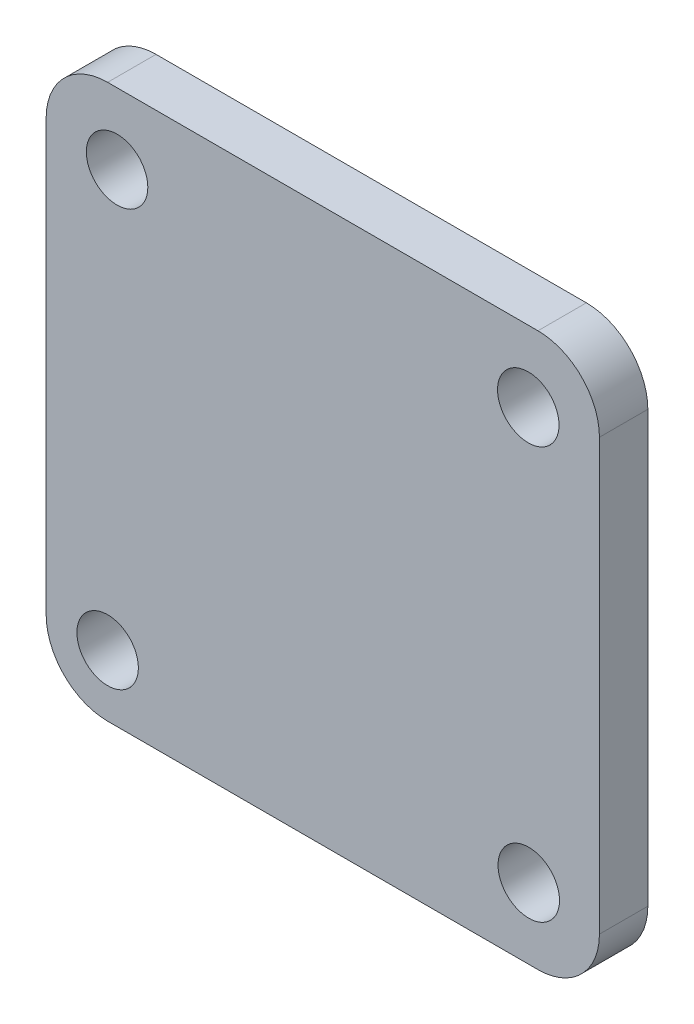
ISO-10303-21;
HEADER;
FILE_DESCRIPTION(('STEP AP214'),'2;1');
FILE_NAME('part.step','',(''),(''),'','','');
FILE_SCHEMA(('AUTOMOTIVE_DESIGN { 1 0 10303 214 1 1 1 1 }'));
ENDSEC;
DATA;
#1=APPLICATION_CONTEXT('core data for automotive mechanical design processes');
#2=APPLICATION_PROTOCOL_DEFINITION('international standard','automotive_design',2000,#1);
#3=PRODUCT_CONTEXT('',#1,'mechanical');
#4=PRODUCT('Part','Part','',(#3));
#5=PRODUCT_RELATED_PRODUCT_CATEGORY('part','',(#4));
#6=PRODUCT_DEFINITION_FORMATION('','',#4);
#7=PRODUCT_DEFINITION_CONTEXT('part definition',#1,'design');
#8=PRODUCT_DEFINITION('design','',#6,#7);
#9=PRODUCT_DEFINITION_SHAPE('','',#8);
#10=(LENGTH_UNIT() NAMED_UNIT(*) SI_UNIT(.MILLI.,.METRE.));
#11=(NAMED_UNIT(*) PLANE_ANGLE_UNIT() SI_UNIT($,.RADIAN.));
#12=(NAMED_UNIT(*) SI_UNIT($,.STERADIAN.) SOLID_ANGLE_UNIT());
#13=UNCERTAINTY_MEASURE_WITH_UNIT(LENGTH_MEASURE(1.E-05),#10,'distance_accuracy_value','');
#14=(GEOMETRIC_REPRESENTATION_CONTEXT(3) GLOBAL_UNCERTAINTY_ASSIGNED_CONTEXT((#13)) GLOBAL_UNIT_ASSIGNED_CONTEXT((#10,
#11,#12)) REPRESENTATION_CONTEXT('',''));
#15=CARTESIAN_POINT('',(0.,0.,0.));
#16=DIRECTION('',(0.,0.,1.));
#17=DIRECTION('',(1.,0.,0.));
#18=AXIS2_PLACEMENT_3D('',#15,#16,#17);
#19=CARTESIAN_POINT('',(1695.26339604643,-374.567950288607,2.));
#20=DIRECTION('',(0.,0.,-1.));
#21=DIRECTION('',(-1.,0.,0.));
#22=AXIS2_PLACEMENT_3D('',#19,#20,#21);
#23=PLANE('',#22);
#24=CARTESIAN_POINT('',(1695.26339604643,-374.567950288607,2.));
#25=DIRECTION('',(0.,0.,1.));
#26=DIRECTION('',(-1.,0.,0.));
#27=AXIS2_PLACEMENT_3D('',#24,#25,#26);
#28=CIRCLE('',#27,2.5400000000001);
#29=CARTESIAN_POINT('',(1692.72339604643,-374.567950288607,2.));
#30=VERTEX_POINT('',#29);
#31=CARTESIAN_POINT('',(1695.26339604643,-377.107950288607,2.));
#32=VERTEX_POINT('',#31);
#33=EDGE_CURVE('E153',#30,#32,#28,.T.);
#34=ORIENTED_EDGE('',*,*,#33,.T.);
#35=DIRECTION('',(1.,0.,0.));
#36=VECTOR('',#35,1.);
#37=CARTESIAN_POINT('',(1695.26339604643,-377.107950288607,2.));
#38=LINE('',#37,#36);
#39=CARTESIAN_POINT('',(1713.04339604643,-377.107950288607,2.));
#40=VERTEX_POINT('',#39);
#41=EDGE_CURVE('E101',#32,#40,#38,.T.);
#42=ORIENTED_EDGE('',*,*,#41,.T.);
#43=CARTESIAN_POINT('',(1713.04339604643,-374.567950288607,2.));
#44=DIRECTION('',(0.,0.,1.));
#45=DIRECTION('',(1.,0.,0.));
#46=AXIS2_PLACEMENT_3D('',#43,#44,#45);
#47=CIRCLE('',#46,2.53999999999999);
#48=CARTESIAN_POINT('',(1715.58339604643,-374.567950288607,2.));
#49=VERTEX_POINT('',#48);
#50=EDGE_CURVE('E169',#40,#49,#47,.T.);
#51=ORIENTED_EDGE('',*,*,#50,.T.);
#52=DIRECTION('',(0.,1.,0.));
#53=VECTOR('',#52,1.);
#54=CARTESIAN_POINT('',(1715.58339604643,-374.567950288607,2.));
#55=LINE('',#54,#53);
#56=CARTESIAN_POINT('',(1715.58339604643,-356.787950288607,2.));
#57=VERTEX_POINT('',#56);
#58=EDGE_CURVE('E182',#49,#57,#55,.T.);
#59=ORIENTED_EDGE('',*,*,#58,.T.);
#60=CARTESIAN_POINT('',(1713.04339604643,-356.787950288607,2.));
#61=DIRECTION('',(0.,0.,1.));
#62=DIRECTION('',(1.,0.,0.));
#63=AXIS2_PLACEMENT_3D('',#60,#61,#62);
#64=CIRCLE('',#63,2.53999999999999);
#65=CARTESIAN_POINT('',(1713.04339604643,-354.247950288607,2.));
#66=VERTEX_POINT('',#65);
#67=EDGE_CURVE('E120',#57,#66,#64,.T.);
#68=ORIENTED_EDGE('',*,*,#67,.T.);
#69=DIRECTION('',(-1.,0.,0.));
#70=VECTOR('',#69,1.);
#71=CARTESIAN_POINT('',(1695.26339604643,-354.247950288607,2.));
#72=LINE('',#71,#70);
#73=CARTESIAN_POINT('',(1695.26339604643,-354.247950288607,2.));
#74=VERTEX_POINT('',#73);
#75=EDGE_CURVE('E111',#66,#74,#72,.T.);
#76=ORIENTED_EDGE('',*,*,#75,.T.);
#77=CARTESIAN_POINT('',(1695.26339604643,-356.787950288607,2.));
#78=DIRECTION('',(0.,0.,1.));
#79=DIRECTION('',(1.,0.,0.));
#80=AXIS2_PLACEMENT_3D('',#77,#78,#79);
#81=CIRCLE('',#80,2.5400000000001);
#82=CARTESIAN_POINT('',(1692.72339604643,-356.787950288607,2.));
#83=VERTEX_POINT('',#82);
#84=EDGE_CURVE('E119',#74,#83,#81,.T.);
#85=ORIENTED_EDGE('',*,*,#84,.T.);
#86=DIRECTION('',(0.,-1.,0.));
#87=VECTOR('',#86,1.);
#88=CARTESIAN_POINT('',(1692.72339604643,-374.567950288607,2.));
#89=LINE('',#88,#87);
#90=EDGE_CURVE('E59',#83,#30,#89,.T.);
#91=ORIENTED_EDGE('',*,*,#90,.T.);
#92=EDGE_LOOP('',(#34,#42,#51,#59,#68,#76,#85,#91));
#93=FACE_BOUND('',#92,.T.);
#94=CARTESIAN_POINT('',(1695.65339604643,-357.176396131549,2.));
#95=DIRECTION('',(0.,0.,1.));
#96=DIRECTION('',(1.,0.,0.));
#97=AXIS2_PLACEMENT_3D('',#94,#95,#96);
#98=CIRCLE('',#97,1.27000000000004);
#99=CARTESIAN_POINT('',(1696.92339604643,-357.176396131549,2.));
#100=VERTEX_POINT('',#99);
#101=EDGE_CURVE('E142',#100,#100,#98,.T.);
#102=ORIENTED_EDGE('',*,*,#101,.F.);
#103=EDGE_LOOP('',(#102));
#104=FACE_BOUND('',#103,.T.);
#105=CARTESIAN_POINT('',(1712.64331448451,-357.188031850525,2.));
#106=DIRECTION('',(0.,0.,1.));
#107=DIRECTION('',(1.,0.,0.));
#108=AXIS2_PLACEMENT_3D('',#105,#106,#107);
#109=CIRCLE('',#108,1.2699999999996);
#110=CARTESIAN_POINT('',(1713.91331448451,-357.188031850525,2.));
#111=VERTEX_POINT('',#110);
#112=EDGE_CURVE('E190',#111,#111,#109,.T.);
#113=ORIENTED_EDGE('',*,*,#112,.F.);
#114=EDGE_LOOP('',(#113));
#115=FACE_BOUND('',#114,.T.);
#116=CARTESIAN_POINT('',(1712.66347760835,-374.188031850526,2.));
#117=DIRECTION('',(0.,0.,1.));
#118=DIRECTION('',(1.,0.,0.));
#119=AXIS2_PLACEMENT_3D('',#116,#117,#118);
#120=CIRCLE('',#119,1.27000000000004);
#121=CARTESIAN_POINT('',(1713.93347760835,-374.188031850526,2.));
#122=VERTEX_POINT('',#121);
#123=EDGE_CURVE('E198',#122,#122,#120,.T.);
#124=ORIENTED_EDGE('',*,*,#123,.F.);
#125=EDGE_LOOP('',(#124));
#126=FACE_BOUND('',#125,.T.);
#127=CARTESIAN_POINT('',(1695.26339604643,-374.567950288607,2.));
#128=DIRECTION('',(0.,0.,1.));
#129=DIRECTION('',(1.,0.,0.));
#130=AXIS2_PLACEMENT_3D('',#127,#128,#129);
#131=CIRCLE('',#130,1.27000000000004);
#132=CARTESIAN_POINT('',(1696.53339604643,-374.567950288607,2.));
#133=VERTEX_POINT('',#132);
#134=EDGE_CURVE('E205',#133,#133,#131,.T.);
#135=ORIENTED_EDGE('',*,*,#134,.F.);
#136=EDGE_LOOP('',(#135));
#137=FACE_BOUND('',#136,.T.);
#138=ADVANCED_FACE('F41',(#93,#104,#115,#126,#137),#23,.F.);
#139=CARTESIAN_POINT('',(1695.26339604643,-374.567950288607,0.));
#140=DIRECTION('',(0.,0.,-1.));
#141=DIRECTION('',(-1.,0.,0.));
#142=AXIS2_PLACEMENT_3D('',#139,#140,#141);
#143=PLANE('',#142);
#144=CARTESIAN_POINT('',(1712.66347760835,-374.188031850526,0.));
#145=DIRECTION('',(0.,0.,1.));
#146=DIRECTION('',(1.,0.,0.));
#147=AXIS2_PLACEMENT_3D('',#144,#145,#146);
#148=CIRCLE('',#147,1.27000000000004);
#149=CARTESIAN_POINT('',(1713.93347760835,-374.188031850526,0.));
#150=VERTEX_POINT('',#149);
#151=EDGE_CURVE('E200',#150,#150,#148,.T.);
#152=ORIENTED_EDGE('',*,*,#151,.T.);
#153=EDGE_LOOP('',(#152));
#154=FACE_BOUND('',#153,.T.);
#155=CARTESIAN_POINT('',(1695.65339604643,-357.176396131549,0.));
#156=DIRECTION('',(0.,0.,1.));
#157=DIRECTION('',(1.,0.,0.));
#158=AXIS2_PLACEMENT_3D('',#155,#156,#157);
#159=CIRCLE('',#158,1.27000000000004);
#160=CARTESIAN_POINT('',(1696.92339604643,-357.176396131549,0.));
#161=VERTEX_POINT('',#160);
#162=EDGE_CURVE('E187',#161,#161,#159,.T.);
#163=ORIENTED_EDGE('',*,*,#162,.T.);
#164=EDGE_LOOP('',(#163));
#165=FACE_BOUND('',#164,.T.);
#166=CARTESIAN_POINT('',(1695.26339604643,-374.567950288607,0.));
#167=DIRECTION('',(0.,0.,1.));
#168=DIRECTION('',(-1.,0.,0.));
#169=AXIS2_PLACEMENT_3D('',#166,#167,#168);
#170=CIRCLE('',#169,2.5400000000001);
#171=CARTESIAN_POINT('',(1692.72339604643,-374.567950288607,0.));
#172=VERTEX_POINT('',#171);
#173=CARTESIAN_POINT('',(1695.26339604643,-377.107950288607,0.));
#174=VERTEX_POINT('',#173);
#175=EDGE_CURVE('E136',#172,#174,#170,.T.);
#176=ORIENTED_EDGE('',*,*,#175,.F.);
#177=DIRECTION('',(0.,-1.,0.));
#178=VECTOR('',#177,1.);
#179=CARTESIAN_POINT('',(1692.72339604643,-374.567950288607,0.));
#180=LINE('',#179,#178);
#181=CARTESIAN_POINT('',(1692.72339604643,-356.787950288607,0.));
#182=VERTEX_POINT('',#181);
#183=EDGE_CURVE('E91',#182,#172,#180,.T.);
#184=ORIENTED_EDGE('',*,*,#183,.F.);
#185=CARTESIAN_POINT('',(1695.26339604643,-356.787950288607,0.));
#186=DIRECTION('',(0.,0.,1.));
#187=DIRECTION('',(1.,0.,0.));
#188=AXIS2_PLACEMENT_3D('',#185,#186,#187);
#189=CIRCLE('',#188,2.5400000000001);
#190=CARTESIAN_POINT('',(1695.26339604643,-354.247950288607,0.));
#191=VERTEX_POINT('',#190);
#192=EDGE_CURVE('E87',#191,#182,#189,.T.);
#193=ORIENTED_EDGE('',*,*,#192,.F.);
#194=DIRECTION('',(-1.,0.,0.));
#195=VECTOR('',#194,1.);
#196=CARTESIAN_POINT('',(1695.26339604643,-354.247950288607,0.));
#197=LINE('',#196,#195);
#198=CARTESIAN_POINT('',(1713.04339604643,-354.247950288607,0.));
#199=VERTEX_POINT('',#198);
#200=EDGE_CURVE('E126',#199,#191,#197,.T.);
#201=ORIENTED_EDGE('',*,*,#200,.F.);
#202=CARTESIAN_POINT('',(1713.04339604643,-356.787950288607,0.));
#203=DIRECTION('',(0.,0.,1.));
#204=DIRECTION('',(1.,0.,0.));
#205=AXIS2_PLACEMENT_3D('',#202,#203,#204);
#206=CIRCLE('',#205,2.53999999999999);
#207=CARTESIAN_POINT('',(1715.58339604643,-356.787950288607,0.));
#208=VERTEX_POINT('',#207);
#209=EDGE_CURVE('E146',#208,#199,#206,.T.);
#210=ORIENTED_EDGE('',*,*,#209,.F.);
#211=DIRECTION('',(0.,1.,0.));
#212=VECTOR('',#211,1.);
#213=CARTESIAN_POINT('',(1715.58339604643,-374.567950288607,0.));
#214=LINE('',#213,#212);
#215=CARTESIAN_POINT('',(1715.58339604643,-374.567950288607,0.));
#216=VERTEX_POINT('',#215);
#217=EDGE_CURVE('E148',#216,#208,#214,.T.);
#218=ORIENTED_EDGE('',*,*,#217,.F.);
#219=CARTESIAN_POINT('',(1713.04339604643,-374.567950288607,0.));
#220=DIRECTION('',(0.,0.,1.));
#221=DIRECTION('',(1.,0.,0.));
#222=AXIS2_PLACEMENT_3D('',#219,#220,#221);
#223=CIRCLE('',#222,2.53999999999999);
#224=CARTESIAN_POINT('',(1713.04339604643,-377.107950288607,0.));
#225=VERTEX_POINT('',#224);
#226=EDGE_CURVE('E145',#225,#216,#223,.T.);
#227=ORIENTED_EDGE('',*,*,#226,.F.);
#228=DIRECTION('',(1.,0.,0.));
#229=VECTOR('',#228,1.);
#230=CARTESIAN_POINT('',(1695.26339604643,-377.107950288607,0.));
#231=LINE('',#230,#229);
#232=EDGE_CURVE('E143',#174,#225,#231,.T.);
#233=ORIENTED_EDGE('',*,*,#232,.F.);
#234=EDGE_LOOP('',(#176,#184,#193,#201,#210,#218,#227,#233));
#235=FACE_BOUND('',#234,.T.);
#236=CARTESIAN_POINT('',(1712.64331448451,-357.188031850525,0.));
#237=DIRECTION('',(0.,0.,1.));
#238=DIRECTION('',(1.,0.,0.));
#239=AXIS2_PLACEMENT_3D('',#236,#237,#238);
#240=CIRCLE('',#239,1.2699999999996);
#241=CARTESIAN_POINT('',(1713.91331448451,-357.188031850525,0.));
#242=VERTEX_POINT('',#241);
#243=EDGE_CURVE('E191',#242,#242,#240,.T.);
#244=ORIENTED_EDGE('',*,*,#243,.T.);
#245=EDGE_LOOP('',(#244));
#246=FACE_BOUND('',#245,.T.);
#247=CARTESIAN_POINT('',(1695.26339604643,-374.567950288607,0.));
#248=DIRECTION('',(0.,0.,1.));
#249=DIRECTION('',(1.,0.,0.));
#250=AXIS2_PLACEMENT_3D('',#247,#248,#249);
#251=CIRCLE('',#250,1.27000000000004);
#252=CARTESIAN_POINT('',(1696.53339604643,-374.567950288607,0.));
#253=VERTEX_POINT('',#252);
#254=EDGE_CURVE('E202',#253,#253,#251,.T.);
#255=ORIENTED_EDGE('',*,*,#254,.T.);
#256=EDGE_LOOP('',(#255));
#257=FACE_BOUND('',#256,.T.);
#258=ADVANCED_FACE('F172',(#154,#165,#235,#246,#257),#143,.T.);
#259=CARTESIAN_POINT('',(1695.26339604643,-374.567950288607,2.));
#260=DIRECTION('',(0.,0.,-1.));
#261=DIRECTION('',(-1.,0.,0.));
#262=AXIS2_PLACEMENT_3D('',#259,#260,#261);
#263=CYLINDRICAL_SURFACE('',#262,2.5400000000001);
#264=ORIENTED_EDGE('',*,*,#175,.T.);
#265=DIRECTION('',(0.,0.,-1.));
#266=VECTOR('',#265,1.);
#267=CARTESIAN_POINT('',(1695.26339604643,-377.107950288607,2.));
#268=LINE('',#267,#266);
#269=EDGE_CURVE('E11',#32,#174,#268,.T.);
#270=ORIENTED_EDGE('',*,*,#269,.F.);
#271=ORIENTED_EDGE('',*,*,#33,.F.);
#272=DIRECTION('',(0.,0.,-1.));
#273=VECTOR('',#272,1.);
#274=CARTESIAN_POINT('',(1692.72339604643,-374.567950288607,2.));
#275=LINE('',#274,#273);
#276=EDGE_CURVE('E133',#30,#172,#275,.T.);
#277=ORIENTED_EDGE('',*,*,#276,.T.);
#278=EDGE_LOOP('',(#264,#270,#271,#277));
#279=FACE_BOUND('',#278,.T.);
#280=ADVANCED_FACE('F43',(#279),#263,.T.);
#281=CARTESIAN_POINT('',(1695.26339604643,-377.107950288607,2.));
#282=DIRECTION('',(0.,1.,0.));
#283=DIRECTION('',(0.,0.,1.));
#284=AXIS2_PLACEMENT_3D('',#281,#282,#283);
#285=PLANE('',#284);
#286=ORIENTED_EDGE('',*,*,#232,.T.);
#287=DIRECTION('',(0.,0.,-1.));
#288=VECTOR('',#287,1.);
#289=CARTESIAN_POINT('',(1713.04339604643,-377.107950288607,2.));
#290=LINE('',#289,#288);
#291=EDGE_CURVE('E49',#40,#225,#290,.T.);
#292=ORIENTED_EDGE('',*,*,#291,.F.);
#293=ORIENTED_EDGE('',*,*,#41,.F.);
#294=ORIENTED_EDGE('',*,*,#269,.T.);
#295=EDGE_LOOP('',(#286,#292,#293,#294));
#296=FACE_BOUND('',#295,.T.);
#297=ADVANCED_FACE('F240',(#296),#285,.F.);
#298=CARTESIAN_POINT('',(1713.04339604643,-374.567950288607,2.));
#299=DIRECTION('',(0.,0.,-1.));
#300=DIRECTION('',(-1.,0.,0.));
#301=AXIS2_PLACEMENT_3D('',#298,#299,#300);
#302=CYLINDRICAL_SURFACE('',#301,2.53999999999999);
#303=ORIENTED_EDGE('',*,*,#226,.T.);
#304=DIRECTION('',(0.,0.,-1.));
#305=VECTOR('',#304,1.);
#306=CARTESIAN_POINT('',(1715.58339604643,-374.567950288607,2.));
#307=LINE('',#306,#305);
#308=EDGE_CURVE('E159',#49,#216,#307,.T.);
#309=ORIENTED_EDGE('',*,*,#308,.F.);
#310=ORIENTED_EDGE('',*,*,#50,.F.);
#311=ORIENTED_EDGE('',*,*,#291,.T.);
#312=EDGE_LOOP('',(#303,#309,#310,#311));
#313=FACE_BOUND('',#312,.T.);
#314=ADVANCED_FACE('F167',(#313),#302,.T.);
#315=CARTESIAN_POINT('',(1715.58339604643,-374.567950288607,2.));
#316=DIRECTION('',(-1.,0.,0.));
#317=DIRECTION('',(0.,0.,1.));
#318=AXIS2_PLACEMENT_3D('',#315,#316,#317);
#319=PLANE('',#318);
#320=ORIENTED_EDGE('',*,*,#217,.T.);
#321=DIRECTION('',(0.,0.,-1.));
#322=VECTOR('',#321,1.);
#323=CARTESIAN_POINT('',(1715.58339604643,-356.787950288607,2.));
#324=LINE('',#323,#322);
#325=EDGE_CURVE('E160',#57,#208,#324,.T.);
#326=ORIENTED_EDGE('',*,*,#325,.F.);
#327=ORIENTED_EDGE('',*,*,#58,.F.);
#328=ORIENTED_EDGE('',*,*,#308,.T.);
#329=EDGE_LOOP('',(#320,#326,#327,#328));
#330=FACE_BOUND('',#329,.T.);
#331=ADVANCED_FACE('F180',(#330),#319,.F.);
#332=CARTESIAN_POINT('',(1713.04339604643,-356.787950288607,2.));
#333=DIRECTION('',(0.,0.,-1.));
#334=DIRECTION('',(-1.,0.,0.));
#335=AXIS2_PLACEMENT_3D('',#332,#333,#334);
#336=CYLINDRICAL_SURFACE('',#335,2.53999999999999);
#337=ORIENTED_EDGE('',*,*,#209,.T.);
#338=DIRECTION('',(0.,0.,-1.));
#339=VECTOR('',#338,1.);
#340=CARTESIAN_POINT('',(1713.04339604643,-354.247950288607,2.));
#341=LINE('',#340,#339);
#342=EDGE_CURVE('E129',#66,#199,#341,.T.);
#343=ORIENTED_EDGE('',*,*,#342,.F.);
#344=ORIENTED_EDGE('',*,*,#67,.F.);
#345=ORIENTED_EDGE('',*,*,#325,.T.);
#346=EDGE_LOOP('',(#337,#343,#344,#345));
#347=FACE_BOUND('',#346,.T.);
#348=ADVANCED_FACE('F179',(#347),#336,.T.);
#349=CARTESIAN_POINT('',(1695.26339604643,-354.247950288607,2.));
#350=DIRECTION('',(0.,-1.,0.));
#351=DIRECTION('',(0.,0.,-1.));
#352=AXIS2_PLACEMENT_3D('',#349,#350,#351);
#353=PLANE('',#352);
#354=ORIENTED_EDGE('',*,*,#200,.T.);
#355=DIRECTION('',(0.,0.,-1.));
#356=VECTOR('',#355,1.);
#357=CARTESIAN_POINT('',(1695.26339604643,-354.247950288607,2.));
#358=LINE('',#357,#356);
#359=EDGE_CURVE('E124',#74,#191,#358,.T.);
#360=ORIENTED_EDGE('',*,*,#359,.F.);
#361=ORIENTED_EDGE('',*,*,#75,.F.);
#362=ORIENTED_EDGE('',*,*,#342,.T.);
#363=EDGE_LOOP('',(#354,#360,#361,#362));
#364=FACE_BOUND('',#363,.T.);
#365=ADVANCED_FACE('F127',(#364),#353,.F.);
#366=CARTESIAN_POINT('',(1695.26339604643,-356.787950288607,2.));
#367=DIRECTION('',(0.,0.,-1.));
#368=DIRECTION('',(-1.,0.,0.));
#369=AXIS2_PLACEMENT_3D('',#366,#367,#368);
#370=CYLINDRICAL_SURFACE('',#369,2.5400000000001);
#371=ORIENTED_EDGE('',*,*,#192,.T.);
#372=DIRECTION('',(0.,0.,-1.));
#373=VECTOR('',#372,1.);
#374=CARTESIAN_POINT('',(1692.72339604643,-356.787950288607,2.));
#375=LINE('',#374,#373);
#376=EDGE_CURVE('E128',#83,#182,#375,.T.);
#377=ORIENTED_EDGE('',*,*,#376,.F.);
#378=ORIENTED_EDGE('',*,*,#84,.F.);
#379=ORIENTED_EDGE('',*,*,#359,.T.);
#380=EDGE_LOOP('',(#371,#377,#378,#379));
#381=FACE_BOUND('',#380,.T.);
#382=ADVANCED_FACE('F132',(#381),#370,.T.);
#383=CARTESIAN_POINT('',(1692.72339604643,-374.567950288607,2.));
#384=DIRECTION('',(1.,0.,0.));
#385=DIRECTION('',(0.,0.,-1.));
#386=AXIS2_PLACEMENT_3D('',#383,#384,#385);
#387=PLANE('',#386);
#388=ORIENTED_EDGE('',*,*,#183,.T.);
#389=ORIENTED_EDGE('',*,*,#276,.F.);
#390=ORIENTED_EDGE('',*,*,#90,.F.);
#391=ORIENTED_EDGE('',*,*,#376,.T.);
#392=EDGE_LOOP('',(#388,#389,#390,#391));
#393=FACE_BOUND('',#392,.T.);
#394=ADVANCED_FACE('F223',(#393),#387,.F.);
#395=CARTESIAN_POINT('',(1695.65339604643,-357.176396131549,2.));
#396=DIRECTION('',(0.,0.,-1.));
#397=DIRECTION('',(-1.,0.,0.));
#398=AXIS2_PLACEMENT_3D('',#395,#396,#397);
#399=CYLINDRICAL_SURFACE('',#398,1.27000000000004);
#400=ORIENTED_EDGE('',*,*,#101,.T.);
#401=EDGE_LOOP('',(#400));
#402=FACE_BOUND('',#401,.T.);
#403=ORIENTED_EDGE('',*,*,#162,.F.);
#404=EDGE_LOOP('',(#403));
#405=FACE_BOUND('',#404,.T.);
#406=ADVANCED_FACE('F225',(#402,#405),#399,.F.);
#407=CARTESIAN_POINT('',(1712.64331448451,-357.188031850525,2.));
#408=DIRECTION('',(0.,0.,-1.));
#409=DIRECTION('',(-1.,0.,0.));
#410=AXIS2_PLACEMENT_3D('',#407,#408,#409);
#411=CYLINDRICAL_SURFACE('',#410,1.2699999999996);
#412=ORIENTED_EDGE('',*,*,#112,.T.);
#413=EDGE_LOOP('',(#412));
#414=FACE_BOUND('',#413,.T.);
#415=ORIENTED_EDGE('',*,*,#243,.F.);
#416=EDGE_LOOP('',(#415));
#417=FACE_BOUND('',#416,.T.);
#418=ADVANCED_FACE('F300',(#414,#417),#411,.F.);
#419=CARTESIAN_POINT('',(1712.66347760835,-374.188031850526,2.));
#420=DIRECTION('',(0.,0.,-1.));
#421=DIRECTION('',(-1.,0.,0.));
#422=AXIS2_PLACEMENT_3D('',#419,#420,#421);
#423=CYLINDRICAL_SURFACE('',#422,1.27000000000004);
#424=ORIENTED_EDGE('',*,*,#123,.T.);
#425=EDGE_LOOP('',(#424));
#426=FACE_BOUND('',#425,.T.);
#427=ORIENTED_EDGE('',*,*,#151,.F.);
#428=EDGE_LOOP('',(#427));
#429=FACE_BOUND('',#428,.T.);
#430=ADVANCED_FACE('F306',(#426,#429),#423,.F.);
#431=CARTESIAN_POINT('',(1695.26339604643,-374.567950288607,2.));
#432=DIRECTION('',(0.,0.,-1.));
#433=DIRECTION('',(-1.,0.,0.));
#434=AXIS2_PLACEMENT_3D('',#431,#432,#433);
#435=CYLINDRICAL_SURFACE('',#434,1.27000000000004);
#436=ORIENTED_EDGE('',*,*,#134,.T.);
#437=EDGE_LOOP('',(#436));
#438=FACE_BOUND('',#437,.T.);
#439=ORIENTED_EDGE('',*,*,#254,.F.);
#440=EDGE_LOOP('',(#439));
#441=FACE_BOUND('',#440,.T.);
#442=ADVANCED_FACE('F211',(#438,#441),#435,.F.);
#443=CLOSED_SHELL('',(#138,#258,#280,#297,#314,#331,#348,#365,#382,#394,#406,#418,#430,#442));
#444=MANIFOLD_SOLID_BREP('B2',#443);
#445=ADVANCED_BREP_SHAPE_REPRESENTATION('',(#18,#444),#14);
#446=SHAPE_DEFINITION_REPRESENTATION(#9,#445);
ENDSEC;
END-ISO-10303-21;
